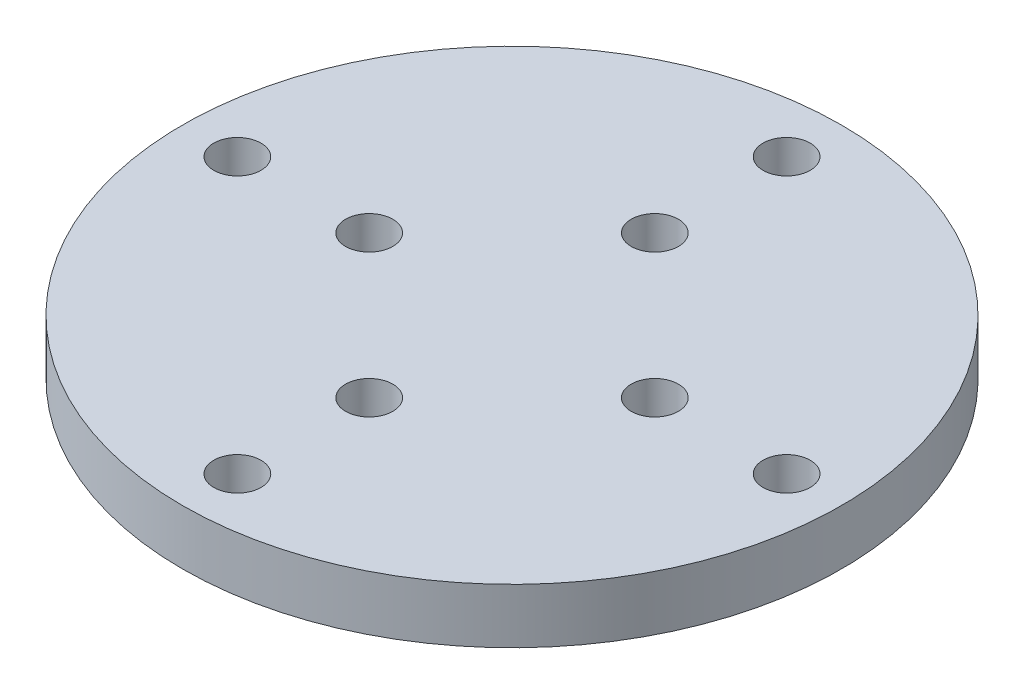
ISO-10303-21;
HEADER;
FILE_DESCRIPTION(('STEP AP214'),'2;1');
FILE_NAME('part.step','',(''),(''),'','','');
FILE_SCHEMA(('AUTOMOTIVE_DESIGN { 1 0 10303 214 1 1 1 1 }'));
ENDSEC;
DATA;
#1=APPLICATION_CONTEXT('core data for automotive mechanical design processes');
#2=APPLICATION_PROTOCOL_DEFINITION('international standard','automotive_design',2000,#1);
#3=PRODUCT_CONTEXT('',#1,'mechanical');
#4=PRODUCT('Part','Part','',(#3));
#5=PRODUCT_RELATED_PRODUCT_CATEGORY('part','',(#4));
#6=PRODUCT_DEFINITION_FORMATION('','',#4);
#7=PRODUCT_DEFINITION_CONTEXT('part definition',#1,'design');
#8=PRODUCT_DEFINITION('design','',#6,#7);
#9=PRODUCT_DEFINITION_SHAPE('','',#8);
#10=(LENGTH_UNIT() NAMED_UNIT(*) SI_UNIT(.MILLI.,.METRE.));
#11=(NAMED_UNIT(*) PLANE_ANGLE_UNIT() SI_UNIT($,.RADIAN.));
#12=(NAMED_UNIT(*) SI_UNIT($,.STERADIAN.) SOLID_ANGLE_UNIT());
#13=UNCERTAINTY_MEASURE_WITH_UNIT(LENGTH_MEASURE(1.E-05),#10,'distance_accuracy_value','');
#14=(GEOMETRIC_REPRESENTATION_CONTEXT(3) GLOBAL_UNCERTAINTY_ASSIGNED_CONTEXT((#13)) GLOBAL_UNIT_ASSIGNED_CONTEXT((#10,
#11,#12)) REPRESENTATION_CONTEXT('',''));
#15=CARTESIAN_POINT('',(0.,0.,0.));
#16=DIRECTION('',(0.,0.,1.));
#17=DIRECTION('',(1.,0.,0.));
#18=AXIS2_PLACEMENT_3D('',#15,#16,#17);
#19=CARTESIAN_POINT('',(0.,5.,0.));
#20=DIRECTION('',(0.,-1.,0.));
#21=DIRECTION('',(0.,0.,-1.));
#22=AXIS2_PLACEMENT_3D('',#19,#20,#21);
#23=CYLINDRICAL_SURFACE('',#22,30.);
#24=CARTESIAN_POINT('',(0.,5.,0.));
#25=DIRECTION('',(0.,1.,0.));
#26=DIRECTION('',(0.,0.,1.));
#27=AXIS2_PLACEMENT_3D('',#24,#25,#26);
#28=CIRCLE('',#27,30.);
#29=CARTESIAN_POINT('',(0.,5.,30.));
#30=VERTEX_POINT('',#29);
#31=EDGE_CURVE('E10',#30,#30,#28,.T.);
#32=ORIENTED_EDGE('',*,*,#31,.F.);
#33=EDGE_LOOP('',(#32));
#34=FACE_BOUND('',#33,.T.);
#35=CARTESIAN_POINT('',(0.,0.,0.));
#36=DIRECTION('',(0.,1.,0.));
#37=DIRECTION('',(0.,0.,1.));
#38=AXIS2_PLACEMENT_3D('',#35,#36,#37);
#39=CIRCLE('',#38,30.);
#40=CARTESIAN_POINT('',(0.,0.,30.));
#41=VERTEX_POINT('',#40);
#42=EDGE_CURVE('E35',#41,#41,#39,.T.);
#43=ORIENTED_EDGE('',*,*,#42,.T.);
#44=EDGE_LOOP('',(#43));
#45=FACE_BOUND('',#44,.T.);
#46=ADVANCED_FACE('F32',(#34,#45),#23,.T.);
#47=CARTESIAN_POINT('',(0.,5.,0.));
#48=DIRECTION('',(0.,1.,0.));
#49=DIRECTION('',(0.,0.,1.));
#50=AXIS2_PLACEMENT_3D('',#47,#48,#49);
#51=PLANE('',#50);
#52=CARTESIAN_POINT('',(-13.,5.,0.));
#53=DIRECTION('',(0.,1.,0.));
#54=DIRECTION('',(0.,0.,1.));
#55=AXIS2_PLACEMENT_3D('',#52,#53,#54);
#56=CIRCLE('',#55,2.14999999999999);
#57=CARTESIAN_POINT('',(-13.,5.,2.14999999999999));
#58=VERTEX_POINT('',#57);
#59=EDGE_CURVE('E88',#58,#58,#56,.T.);
#60=ORIENTED_EDGE('',*,*,#59,.F.);
#61=EDGE_LOOP('',(#60));
#62=FACE_BOUND('',#61,.T.);
#63=CARTESIAN_POINT('',(13.,5.,0.));
#64=DIRECTION('',(0.,1.,0.));
#65=DIRECTION('',(0.,0.,1.));
#66=AXIS2_PLACEMENT_3D('',#63,#64,#65);
#67=CIRCLE('',#66,2.14999999999999);
#68=CARTESIAN_POINT('',(13.,5.,2.14999999999999));
#69=VERTEX_POINT('',#68);
#70=EDGE_CURVE('E82',#69,#69,#67,.T.);
#71=ORIENTED_EDGE('',*,*,#70,.F.);
#72=EDGE_LOOP('',(#71));
#73=FACE_BOUND('',#72,.T.);
#74=CARTESIAN_POINT('',(0.,5.,-13.));
#75=DIRECTION('',(0.,1.,0.));
#76=DIRECTION('',(0.,0.,1.));
#77=AXIS2_PLACEMENT_3D('',#74,#75,#76);
#78=CIRCLE('',#77,2.14999999999999);
#79=CARTESIAN_POINT('',(0.,5.,-10.85));
#80=VERTEX_POINT('',#79);
#81=EDGE_CURVE('E76',#80,#80,#78,.T.);
#82=ORIENTED_EDGE('',*,*,#81,.F.);
#83=EDGE_LOOP('',(#82));
#84=FACE_BOUND('',#83,.T.);
#85=CARTESIAN_POINT('',(0.,5.,13.));
#86=DIRECTION('',(0.,1.,0.));
#87=DIRECTION('',(0.,0.,1.));
#88=AXIS2_PLACEMENT_3D('',#85,#86,#87);
#89=CIRCLE('',#88,2.14999999999999);
#90=CARTESIAN_POINT('',(0.,5.,15.15));
#91=VERTEX_POINT('',#90);
#92=EDGE_CURVE('E70',#91,#91,#89,.T.);
#93=ORIENTED_EDGE('',*,*,#92,.F.);
#94=EDGE_LOOP('',(#93));
#95=FACE_BOUND('',#94,.T.);
#96=CARTESIAN_POINT('',(0.,5.,25.));
#97=DIRECTION('',(0.,1.,0.));
#98=DIRECTION('',(0.,0.,1.));
#99=AXIS2_PLACEMENT_3D('',#96,#97,#98);
#100=CIRCLE('',#99,2.14999999999999);
#101=CARTESIAN_POINT('',(0.,5.,27.15));
#102=VERTEX_POINT('',#101);
#103=EDGE_CURVE('E64',#102,#102,#100,.T.);
#104=ORIENTED_EDGE('',*,*,#103,.F.);
#105=EDGE_LOOP('',(#104));
#106=FACE_BOUND('',#105,.T.);
#107=CARTESIAN_POINT('',(-25.,5.,0.));
#108=DIRECTION('',(0.,1.,0.));
#109=DIRECTION('',(0.,0.,1.));
#110=AXIS2_PLACEMENT_3D('',#107,#108,#109);
#111=CIRCLE('',#110,2.14999999999999);
#112=CARTESIAN_POINT('',(-25.,5.,2.14999999999999));
#113=VERTEX_POINT('',#112);
#114=EDGE_CURVE('E58',#113,#113,#111,.T.);
#115=ORIENTED_EDGE('',*,*,#114,.F.);
#116=EDGE_LOOP('',(#115));
#117=FACE_BOUND('',#116,.T.);
#118=CARTESIAN_POINT('',(25.,5.,0.));
#119=DIRECTION('',(0.,1.,0.));
#120=DIRECTION('',(0.,0.,1.));
#121=AXIS2_PLACEMENT_3D('',#118,#119,#120);
#122=CIRCLE('',#121,2.14999999999999);
#123=CARTESIAN_POINT('',(25.,5.,2.14999999999999));
#124=VERTEX_POINT('',#123);
#125=EDGE_CURVE('E52',#124,#124,#122,.T.);
#126=ORIENTED_EDGE('',*,*,#125,.F.);
#127=EDGE_LOOP('',(#126));
#128=FACE_BOUND('',#127,.T.);
#129=CARTESIAN_POINT('',(0.,5.,-25.));
#130=DIRECTION('',(0.,1.,0.));
#131=DIRECTION('',(0.,0.,1.));
#132=AXIS2_PLACEMENT_3D('',#129,#130,#131);
#133=CIRCLE('',#132,2.14999999999999);
#134=CARTESIAN_POINT('',(0.,5.,-22.85));
#135=VERTEX_POINT('',#134);
#136=EDGE_CURVE('E46',#135,#135,#133,.T.);
#137=ORIENTED_EDGE('',*,*,#136,.F.);
#138=EDGE_LOOP('',(#137));
#139=FACE_BOUND('',#138,.T.);
#140=ORIENTED_EDGE('',*,*,#31,.T.);
#141=EDGE_LOOP('',(#140));
#142=FACE_BOUND('',#141,.T.);
#143=ADVANCED_FACE('F94',(#62,#73,#84,#95,#106,#117,#128,#139,#142),#51,.T.);
#144=CARTESIAN_POINT('',(0.,0.,0.));
#145=DIRECTION('',(0.,1.,0.));
#146=DIRECTION('',(0.,0.,1.));
#147=AXIS2_PLACEMENT_3D('',#144,#145,#146);
#148=PLANE('',#147);
#149=CARTESIAN_POINT('',(-13.,0.,0.));
#150=DIRECTION('',(0.,1.,0.));
#151=DIRECTION('',(0.,0.,1.));
#152=AXIS2_PLACEMENT_3D('',#149,#150,#151);
#153=CIRCLE('',#152,2.15);
#154=CARTESIAN_POINT('',(-13.,0.,2.15));
#155=VERTEX_POINT('',#154);
#156=EDGE_CURVE('E85',#155,#155,#153,.T.);
#157=ORIENTED_EDGE('',*,*,#156,.T.);
#158=EDGE_LOOP('',(#157));
#159=FACE_BOUND('',#158,.T.);
#160=CARTESIAN_POINT('',(13.,0.,0.));
#161=DIRECTION('',(0.,1.,0.));
#162=DIRECTION('',(0.,0.,1.));
#163=AXIS2_PLACEMENT_3D('',#160,#161,#162);
#164=CIRCLE('',#163,2.15);
#165=CARTESIAN_POINT('',(13.,0.,2.15));
#166=VERTEX_POINT('',#165);
#167=EDGE_CURVE('E79',#166,#166,#164,.T.);
#168=ORIENTED_EDGE('',*,*,#167,.T.);
#169=EDGE_LOOP('',(#168));
#170=FACE_BOUND('',#169,.T.);
#171=CARTESIAN_POINT('',(0.,0.,-13.));
#172=DIRECTION('',(0.,1.,0.));
#173=DIRECTION('',(0.,0.,1.));
#174=AXIS2_PLACEMENT_3D('',#171,#172,#173);
#175=CIRCLE('',#174,2.15);
#176=CARTESIAN_POINT('',(0.,0.,-10.85));
#177=VERTEX_POINT('',#176);
#178=EDGE_CURVE('E73',#177,#177,#175,.T.);
#179=ORIENTED_EDGE('',*,*,#178,.T.);
#180=EDGE_LOOP('',(#179));
#181=FACE_BOUND('',#180,.T.);
#182=CARTESIAN_POINT('',(0.,0.,13.));
#183=DIRECTION('',(0.,1.,0.));
#184=DIRECTION('',(0.,0.,1.));
#185=AXIS2_PLACEMENT_3D('',#182,#183,#184);
#186=CIRCLE('',#185,2.15);
#187=CARTESIAN_POINT('',(0.,0.,15.15));
#188=VERTEX_POINT('',#187);
#189=EDGE_CURVE('E67',#188,#188,#186,.T.);
#190=ORIENTED_EDGE('',*,*,#189,.T.);
#191=EDGE_LOOP('',(#190));
#192=FACE_BOUND('',#191,.T.);
#193=CARTESIAN_POINT('',(0.,0.,25.));
#194=DIRECTION('',(0.,1.,0.));
#195=DIRECTION('',(0.,0.,1.));
#196=AXIS2_PLACEMENT_3D('',#193,#194,#195);
#197=CIRCLE('',#196,2.15);
#198=CARTESIAN_POINT('',(0.,0.,27.15));
#199=VERTEX_POINT('',#198);
#200=EDGE_CURVE('E61',#199,#199,#197,.T.);
#201=ORIENTED_EDGE('',*,*,#200,.T.);
#202=EDGE_LOOP('',(#201));
#203=FACE_BOUND('',#202,.T.);
#204=CARTESIAN_POINT('',(-25.,0.,0.));
#205=DIRECTION('',(0.,1.,0.));
#206=DIRECTION('',(0.,0.,1.));
#207=AXIS2_PLACEMENT_3D('',#204,#205,#206);
#208=CIRCLE('',#207,2.15);
#209=CARTESIAN_POINT('',(-25.,0.,2.15));
#210=VERTEX_POINT('',#209);
#211=EDGE_CURVE('E55',#210,#210,#208,.T.);
#212=ORIENTED_EDGE('',*,*,#211,.T.);
#213=EDGE_LOOP('',(#212));
#214=FACE_BOUND('',#213,.T.);
#215=CARTESIAN_POINT('',(25.,0.,0.));
#216=DIRECTION('',(0.,1.,0.));
#217=DIRECTION('',(0.,0.,1.));
#218=AXIS2_PLACEMENT_3D('',#215,#216,#217);
#219=CIRCLE('',#218,2.15);
#220=CARTESIAN_POINT('',(25.,0.,2.15));
#221=VERTEX_POINT('',#220);
#222=EDGE_CURVE('E49',#221,#221,#219,.T.);
#223=ORIENTED_EDGE('',*,*,#222,.T.);
#224=EDGE_LOOP('',(#223));
#225=FACE_BOUND('',#224,.T.);
#226=CARTESIAN_POINT('',(0.,0.,-25.));
#227=DIRECTION('',(0.,1.,0.));
#228=DIRECTION('',(0.,0.,1.));
#229=AXIS2_PLACEMENT_3D('',#226,#227,#228);
#230=CIRCLE('',#229,2.15);
#231=CARTESIAN_POINT('',(0.,0.,-22.85));
#232=VERTEX_POINT('',#231);
#233=EDGE_CURVE('E42',#232,#232,#230,.T.);
#234=ORIENTED_EDGE('',*,*,#233,.T.);
#235=EDGE_LOOP('',(#234));
#236=FACE_BOUND('',#235,.T.);
#237=ORIENTED_EDGE('',*,*,#42,.F.);
#238=EDGE_LOOP('',(#237));
#239=FACE_BOUND('',#238,.T.);
#240=ADVANCED_FACE('F97',(#159,#170,#181,#192,#203,#214,#225,#236,#239),#148,.F.);
#241=CARTESIAN_POINT('',(0.,5.,-25.));
#242=DIRECTION('',(0.,1.,0.));
#243=DIRECTION('',(0.,0.,1.));
#244=AXIS2_PLACEMENT_3D('',#241,#242,#243);
#245=CYLINDRICAL_SURFACE('',#244,2.14999999999999);
#246=ORIENTED_EDGE('',*,*,#233,.F.);
#247=EDGE_LOOP('',(#246));
#248=FACE_BOUND('',#247,.T.);
#249=ORIENTED_EDGE('',*,*,#136,.T.);
#250=EDGE_LOOP('',(#249));
#251=FACE_BOUND('',#250,.T.);
#252=ADVANCED_FACE('F113',(#248,#251),#245,.F.);
#253=CARTESIAN_POINT('',(25.,5.,0.));
#254=DIRECTION('',(0.,1.,0.));
#255=DIRECTION('',(0.,0.,1.));
#256=AXIS2_PLACEMENT_3D('',#253,#254,#255);
#257=CYLINDRICAL_SURFACE('',#256,2.14999999999999);
#258=ORIENTED_EDGE('',*,*,#222,.F.);
#259=EDGE_LOOP('',(#258));
#260=FACE_BOUND('',#259,.T.);
#261=ORIENTED_EDGE('',*,*,#125,.T.);
#262=EDGE_LOOP('',(#261));
#263=FACE_BOUND('',#262,.T.);
#264=ADVANCED_FACE('F115',(#260,#263),#257,.F.);
#265=CARTESIAN_POINT('',(-25.,5.,0.));
#266=DIRECTION('',(0.,1.,0.));
#267=DIRECTION('',(0.,0.,1.));
#268=AXIS2_PLACEMENT_3D('',#265,#266,#267);
#269=CYLINDRICAL_SURFACE('',#268,2.14999999999999);
#270=ORIENTED_EDGE('',*,*,#211,.F.);
#271=EDGE_LOOP('',(#270));
#272=FACE_BOUND('',#271,.T.);
#273=ORIENTED_EDGE('',*,*,#114,.T.);
#274=EDGE_LOOP('',(#273));
#275=FACE_BOUND('',#274,.T.);
#276=ADVANCED_FACE('F122',(#272,#275),#269,.F.);
#277=CARTESIAN_POINT('',(0.,5.,25.));
#278=DIRECTION('',(0.,1.,0.));
#279=DIRECTION('',(0.,0.,1.));
#280=AXIS2_PLACEMENT_3D('',#277,#278,#279);
#281=CYLINDRICAL_SURFACE('',#280,2.14999999999999);
#282=ORIENTED_EDGE('',*,*,#200,.F.);
#283=EDGE_LOOP('',(#282));
#284=FACE_BOUND('',#283,.T.);
#285=ORIENTED_EDGE('',*,*,#103,.T.);
#286=EDGE_LOOP('',(#285));
#287=FACE_BOUND('',#286,.T.);
#288=ADVANCED_FACE('F155',(#284,#287),#281,.F.);
#289=CARTESIAN_POINT('',(0.,5.,13.));
#290=DIRECTION('',(0.,1.,0.));
#291=DIRECTION('',(0.,0.,1.));
#292=AXIS2_PLACEMENT_3D('',#289,#290,#291);
#293=CYLINDRICAL_SURFACE('',#292,2.14999999999999);
#294=ORIENTED_EDGE('',*,*,#189,.F.);
#295=EDGE_LOOP('',(#294));
#296=FACE_BOUND('',#295,.T.);
#297=ORIENTED_EDGE('',*,*,#92,.T.);
#298=EDGE_LOOP('',(#297));
#299=FACE_BOUND('',#298,.T.);
#300=ADVANCED_FACE('F149',(#296,#299),#293,.F.);
#301=CARTESIAN_POINT('',(0.,5.,-13.));
#302=DIRECTION('',(0.,1.,0.));
#303=DIRECTION('',(0.,0.,1.));
#304=AXIS2_PLACEMENT_3D('',#301,#302,#303);
#305=CYLINDRICAL_SURFACE('',#304,2.14999999999999);
#306=ORIENTED_EDGE('',*,*,#178,.F.);
#307=EDGE_LOOP('',(#306));
#308=FACE_BOUND('',#307,.T.);
#309=ORIENTED_EDGE('',*,*,#81,.T.);
#310=EDGE_LOOP('',(#309));
#311=FACE_BOUND('',#310,.T.);
#312=ADVANCED_FACE('F154',(#308,#311),#305,.F.);
#313=CARTESIAN_POINT('',(13.,5.,0.));
#314=DIRECTION('',(0.,1.,0.));
#315=DIRECTION('',(0.,0.,1.));
#316=AXIS2_PLACEMENT_3D('',#313,#314,#315);
#317=CYLINDRICAL_SURFACE('',#316,2.14999999999999);
#318=ORIENTED_EDGE('',*,*,#167,.F.);
#319=EDGE_LOOP('',(#318));
#320=FACE_BOUND('',#319,.T.);
#321=ORIENTED_EDGE('',*,*,#70,.T.);
#322=EDGE_LOOP('',(#321));
#323=FACE_BOUND('',#322,.T.);
#324=ADVANCED_FACE('F167',(#320,#323),#317,.F.);
#325=CARTESIAN_POINT('',(-13.,5.,0.));
#326=DIRECTION('',(0.,1.,0.));
#327=DIRECTION('',(0.,0.,1.));
#328=AXIS2_PLACEMENT_3D('',#325,#326,#327);
#329=CYLINDRICAL_SURFACE('',#328,2.14999999999999);
#330=ORIENTED_EDGE('',*,*,#156,.F.);
#331=EDGE_LOOP('',(#330));
#332=FACE_BOUND('',#331,.T.);
#333=ORIENTED_EDGE('',*,*,#59,.T.);
#334=EDGE_LOOP('',(#333));
#335=FACE_BOUND('',#334,.T.);
#336=ADVANCED_FACE('F92',(#332,#335),#329,.F.);
#337=CLOSED_SHELL('',(#46,#143,#240,#252,#264,#276,#288,#300,#312,#324,#336));
#338=MANIFOLD_SOLID_BREP('B2',#337);
#339=ADVANCED_BREP_SHAPE_REPRESENTATION('',(#18,#338),#14);
#340=SHAPE_DEFINITION_REPRESENTATION(#9,#339);
ENDSEC;
END-ISO-10303-21;
